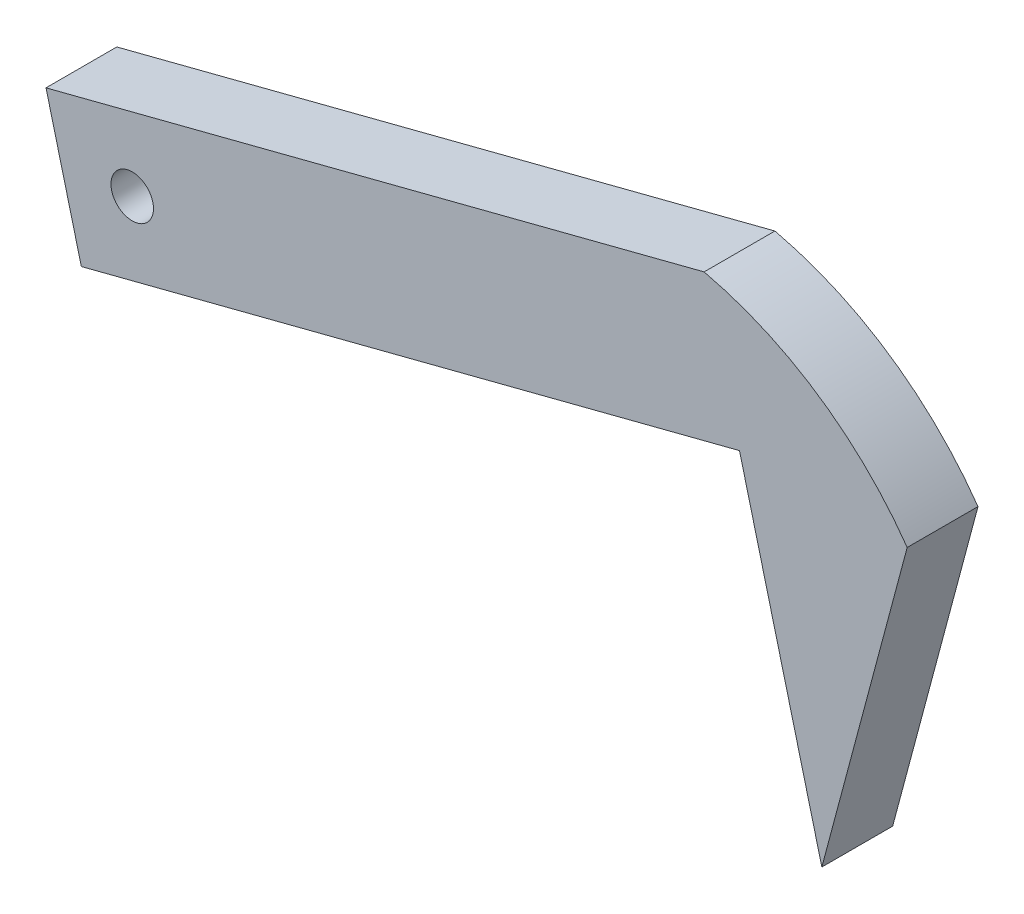
ISO-10303-21;
HEADER;
FILE_DESCRIPTION(('STEP AP214'),'2;1');
FILE_NAME('part.step','',(''),(''),'','','');
FILE_SCHEMA(('AUTOMOTIVE_DESIGN { 1 0 10303 214 1 1 1 1 }'));
ENDSEC;
DATA;
#1=APPLICATION_CONTEXT('core data for automotive mechanical design processes');
#2=APPLICATION_PROTOCOL_DEFINITION('international standard','automotive_design',2000,#1);
#3=PRODUCT_CONTEXT('',#1,'mechanical');
#4=PRODUCT('Part','Part','',(#3));
#5=PRODUCT_RELATED_PRODUCT_CATEGORY('part','',(#4));
#6=PRODUCT_DEFINITION_FORMATION('','',#4);
#7=PRODUCT_DEFINITION_CONTEXT('part definition',#1,'design');
#8=PRODUCT_DEFINITION('design','',#6,#7);
#9=PRODUCT_DEFINITION_SHAPE('','',#8);
#10=(LENGTH_UNIT() NAMED_UNIT(*) SI_UNIT(.MILLI.,.METRE.));
#11=(NAMED_UNIT(*) PLANE_ANGLE_UNIT() SI_UNIT($,.RADIAN.));
#12=(NAMED_UNIT(*) SI_UNIT($,.STERADIAN.) SOLID_ANGLE_UNIT());
#13=UNCERTAINTY_MEASURE_WITH_UNIT(LENGTH_MEASURE(1.E-05),#10,'distance_accuracy_value','');
#14=(GEOMETRIC_REPRESENTATION_CONTEXT(3) GLOBAL_UNCERTAINTY_ASSIGNED_CONTEXT((#13)) GLOBAL_UNIT_ASSIGNED_CONTEXT((#10,
#11,#12)) REPRESENTATION_CONTEXT('',''));
#15=CARTESIAN_POINT('',(0.,0.,0.));
#16=DIRECTION('',(0.,0.,1.));
#17=DIRECTION('',(1.,0.,0.));
#18=AXIS2_PLACEMENT_3D('',#15,#16,#17);
#19=CARTESIAN_POINT('',(40.949350237499,-11.6712049564434,5.));
#20=DIRECTION('',(0.,0.,-1.));
#21=DIRECTION('',(-1.,0.,0.));
#22=AXIS2_PLACEMENT_3D('',#19,#20,#21);
#23=PLANE('',#22);
#24=DIRECTION('',(-0.968342674749057,-0.249624646739542,0.));
#25=VECTOR('',#24,1.);
#26=CARTESIAN_POINT('',(0.,0.,5.));
#27=LINE('',#26,#25);
#28=CARTESIAN_POINT('',(46.4804483879548,11.981983043498,5.));
#29=VERTEX_POINT('',#28);
#30=CARTESIAN_POINT('',(0.,0.,5.));
#31=VERTEX_POINT('',#30);
#32=EDGE_CURVE('E128',#29,#31,#27,.T.);
#33=ORIENTED_EDGE('',*,*,#32,.T.);
#34=DIRECTION('',(0.249624646739542,-0.968342674749057,0.));
#35=VECTOR('',#34,1.);
#36=CARTESIAN_POINT('',(2.49624646739542,-9.68342674749057,5.));
#37=LINE('',#36,#35);
#38=CARTESIAN_POINT('',(2.49624646739542,-9.68342674749057,5.));
#39=VERTEX_POINT('',#38);
#40=EDGE_CURVE('E86',#31,#39,#37,.T.);
#41=ORIENTED_EDGE('',*,*,#40,.T.);
#42=DIRECTION('',(0.968342674749057,0.249624646739542,0.));
#43=VECTOR('',#42,1.);
#44=CARTESIAN_POINT('',(48.9766948553502,2.29855629600746,5.));
#45=LINE('',#44,#43);
#46=CARTESIAN_POINT('',(48.9766948553502,2.29855629600746,5.));
#47=VERTEX_POINT('',#46);
#48=EDGE_CURVE('E99',#39,#47,#45,.T.);
#49=ORIENTED_EDGE('',*,*,#48,.T.);
#50=DIRECTION('',(0.249624646739542,-0.968342674749057,0.));
#51=VECTOR('',#50,1.);
#52=CARTESIAN_POINT('',(48.9766948553502,2.29855629600746,5.));
#53=LINE('',#52,#51);
#54=CARTESIAN_POINT('',(54.7929576943068,-20.2638612700566,5.));
#55=VERTEX_POINT('',#54);
#56=EDGE_CURVE('E93',#47,#55,#53,.T.);
#57=ORIENTED_EDGE('',*,*,#56,.T.);
#58=DIRECTION('',(0.258148083591803,0.966105360164138,0.));
#59=VECTOR('',#58,1.);
#60=CARTESIAN_POINT('',(60.8217461640115,2.29855629600746,5.));
#61=LINE('',#60,#59);
#62=CARTESIAN_POINT('',(60.8217461640115,2.29855629600746,5.));
#63=VERTEX_POINT('',#62);
#64=EDGE_CURVE('E97',#55,#63,#61,.T.);
#65=ORIENTED_EDGE('',*,*,#64,.T.);
#66=CARTESIAN_POINT('',(40.949350237499,-11.6712049564434,5.));
#67=DIRECTION('',(0.,0.,1.));
#68=DIRECTION('',(-1.,0.,0.));
#69=AXIS2_PLACEMENT_3D('',#66,#67,#68);
#70=CIRCLE('',#69,24.2912813435304);
#71=EDGE_CURVE('E49',#63,#29,#70,.T.);
#72=ORIENTED_EDGE('',*,*,#71,.T.);
#73=EDGE_LOOP('',(#33,#41,#49,#57,#65,#72));
#74=FACE_BOUND('',#73,.T.);
#75=CARTESIAN_POINT('',(6.089836607443,-3.59359014004758,5.));
#76=DIRECTION('',(0.,0.,1.));
#77=DIRECTION('',(1.,0.,0.));
#78=AXIS2_PLACEMENT_3D('',#75,#76,#77);
#79=CIRCLE('',#78,1.5);
#80=CARTESIAN_POINT('',(7.589836607443,-3.59359014004758,5.));
#81=VERTEX_POINT('',#80);
#82=EDGE_CURVE('E121',#81,#81,#79,.T.);
#83=ORIENTED_EDGE('',*,*,#82,.F.);
#84=EDGE_LOOP('',(#83));
#85=FACE_BOUND('',#84,.T.);
#86=ADVANCED_FACE('F32',(#74,#85),#23,.F.);
#87=CARTESIAN_POINT('',(40.949350237499,-11.6712049564434,0.));
#88=DIRECTION('',(0.,0.,-1.));
#89=DIRECTION('',(-1.,0.,0.));
#90=AXIS2_PLACEMENT_3D('',#87,#88,#89);
#91=PLANE('',#90);
#92=DIRECTION('',(-0.968342674749057,-0.249624646739542,0.));
#93=VECTOR('',#92,1.);
#94=CARTESIAN_POINT('',(0.,0.,0.));
#95=LINE('',#94,#93);
#96=CARTESIAN_POINT('',(46.4804483879548,11.981983043498,0.));
#97=VERTEX_POINT('',#96);
#98=CARTESIAN_POINT('',(0.,0.,0.));
#99=VERTEX_POINT('',#98);
#100=EDGE_CURVE('E117',#97,#99,#95,.T.);
#101=ORIENTED_EDGE('',*,*,#100,.F.);
#102=CARTESIAN_POINT('',(40.949350237499,-11.6712049564434,0.));
#103=DIRECTION('',(0.,0.,1.));
#104=DIRECTION('',(-1.,0.,0.));
#105=AXIS2_PLACEMENT_3D('',#102,#103,#104);
#106=CIRCLE('',#105,24.2912813435304);
#107=CARTESIAN_POINT('',(60.8217461640115,2.29855629600746,0.));
#108=VERTEX_POINT('',#107);
#109=EDGE_CURVE('E78',#108,#97,#106,.T.);
#110=ORIENTED_EDGE('',*,*,#109,.F.);
#111=DIRECTION('',(0.258148083591803,0.966105360164138,0.));
#112=VECTOR('',#111,1.);
#113=CARTESIAN_POINT('',(60.8217461640115,2.29855629600746,0.));
#114=LINE('',#113,#112);
#115=CARTESIAN_POINT('',(54.7929576943068,-20.2638612700566,0.));
#116=VERTEX_POINT('',#115);
#117=EDGE_CURVE('E72',#116,#108,#114,.T.);
#118=ORIENTED_EDGE('',*,*,#117,.F.);
#119=DIRECTION('',(0.249624646739542,-0.968342674749057,0.));
#120=VECTOR('',#119,1.);
#121=CARTESIAN_POINT('',(48.9766948553502,2.29855629600746,0.));
#122=LINE('',#121,#120);
#123=CARTESIAN_POINT('',(48.9766948553502,2.29855629600746,0.));
#124=VERTEX_POINT('',#123);
#125=EDGE_CURVE('E107',#124,#116,#122,.T.);
#126=ORIENTED_EDGE('',*,*,#125,.F.);
#127=DIRECTION('',(0.968342674749057,0.249624646739542,0.));
#128=VECTOR('',#127,1.);
#129=CARTESIAN_POINT('',(48.9766948553502,2.29855629600746,0.));
#130=LINE('',#129,#128);
#131=CARTESIAN_POINT('',(2.49624646739542,-9.68342674749057,0.));
#132=VERTEX_POINT('',#131);
#133=EDGE_CURVE('E123',#132,#124,#130,.T.);
#134=ORIENTED_EDGE('',*,*,#133,.F.);
#135=DIRECTION('',(0.249624646739542,-0.968342674749057,0.));
#136=VECTOR('',#135,1.);
#137=CARTESIAN_POINT('',(2.49624646739542,-9.68342674749057,0.));
#138=LINE('',#137,#136);
#139=EDGE_CURVE('E120',#99,#132,#138,.T.);
#140=ORIENTED_EDGE('',*,*,#139,.F.);
#141=EDGE_LOOP('',(#101,#110,#118,#126,#134,#140));
#142=FACE_BOUND('',#141,.T.);
#143=CARTESIAN_POINT('',(6.089836607443,-3.59359014004758,0.));
#144=DIRECTION('',(0.,0.,1.));
#145=DIRECTION('',(1.,0.,0.));
#146=AXIS2_PLACEMENT_3D('',#143,#144,#145);
#147=CIRCLE('',#146,1.5);
#148=CARTESIAN_POINT('',(7.589836607443,-3.59359014004758,0.));
#149=VERTEX_POINT('',#148);
#150=EDGE_CURVE('E221',#149,#149,#147,.T.);
#151=ORIENTED_EDGE('',*,*,#150,.T.);
#152=EDGE_LOOP('',(#151));
#153=FACE_BOUND('',#152,.T.);
#154=ADVANCED_FACE('F137',(#142,#153),#91,.T.);
#155=CARTESIAN_POINT('',(0.,0.,5.));
#156=DIRECTION('',(0.249624646739542,-0.968342674749057,0.));
#157=DIRECTION('',(0.968342674749058,0.249624646739542,0.));
#158=AXIS2_PLACEMENT_3D('',#155,#156,#157);
#159=PLANE('',#158);
#160=ORIENTED_EDGE('',*,*,#100,.T.);
#161=DIRECTION('',(0.,0.,-1.));
#162=VECTOR('',#161,1.);
#163=CARTESIAN_POINT('',(0.,0.,5.));
#164=LINE('',#163,#162);
#165=EDGE_CURVE('E11',#31,#99,#164,.T.);
#166=ORIENTED_EDGE('',*,*,#165,.F.);
#167=ORIENTED_EDGE('',*,*,#32,.F.);
#168=DIRECTION('',(0.,0.,-1.));
#169=VECTOR('',#168,1.);
#170=CARTESIAN_POINT('',(46.4804483879548,11.981983043498,5.));
#171=LINE('',#170,#169);
#172=EDGE_CURVE('E113',#29,#97,#171,.T.);
#173=ORIENTED_EDGE('',*,*,#172,.T.);
#174=EDGE_LOOP('',(#160,#166,#167,#173));
#175=FACE_BOUND('',#174,.T.);
#176=ADVANCED_FACE('F34',(#175),#159,.F.);
#177=CARTESIAN_POINT('',(2.49624646739542,-9.68342674749057,5.));
#178=DIRECTION('',(0.968342674749057,0.249624646739542,0.));
#179=DIRECTION('',(-0.249624646739542,0.968342674749058,0.));
#180=AXIS2_PLACEMENT_3D('',#177,#178,#179);
#181=PLANE('',#180);
#182=ORIENTED_EDGE('',*,*,#139,.T.);
#183=DIRECTION('',(0.,0.,-1.));
#184=VECTOR('',#183,1.);
#185=CARTESIAN_POINT('',(2.49624646739542,-9.68342674749057,5.));
#186=LINE('',#185,#184);
#187=EDGE_CURVE('E41',#39,#132,#186,.T.);
#188=ORIENTED_EDGE('',*,*,#187,.F.);
#189=ORIENTED_EDGE('',*,*,#40,.F.);
#190=ORIENTED_EDGE('',*,*,#165,.T.);
#191=EDGE_LOOP('',(#182,#188,#189,#190));
#192=FACE_BOUND('',#191,.T.);
#193=ADVANCED_FACE('F162',(#192),#181,.F.);
#194=CARTESIAN_POINT('',(48.9766948553502,2.29855629600746,5.));
#195=DIRECTION('',(-0.249624646739542,0.968342674749057,0.));
#196=DIRECTION('',(-0.968342674749057,-0.249624646739542,0.));
#197=AXIS2_PLACEMENT_3D('',#194,#195,#196);
#198=PLANE('',#197);
#199=ORIENTED_EDGE('',*,*,#133,.T.);
#200=DIRECTION('',(0.,0.,-1.));
#201=VECTOR('',#200,1.);
#202=CARTESIAN_POINT('',(48.9766948553502,2.29855629600746,5.));
#203=LINE('',#202,#201);
#204=EDGE_CURVE('E108',#47,#124,#203,.T.);
#205=ORIENTED_EDGE('',*,*,#204,.F.);
#206=ORIENTED_EDGE('',*,*,#48,.F.);
#207=ORIENTED_EDGE('',*,*,#187,.T.);
#208=EDGE_LOOP('',(#199,#205,#206,#207));
#209=FACE_BOUND('',#208,.T.);
#210=ADVANCED_FACE('F134',(#209),#198,.F.);
#211=CARTESIAN_POINT('',(48.9766948553502,2.29855629600746,5.));
#212=DIRECTION('',(0.968342674749057,0.249624646739542,0.));
#213=DIRECTION('',(-0.249624646739542,0.968342674749057,0.));
#214=AXIS2_PLACEMENT_3D('',#211,#212,#213);
#215=PLANE('',#214);
#216=ORIENTED_EDGE('',*,*,#125,.T.);
#217=DIRECTION('',(0.,0.,-1.));
#218=VECTOR('',#217,1.);
#219=CARTESIAN_POINT('',(54.7929576943068,-20.2638612700566,5.));
#220=LINE('',#219,#218);
#221=EDGE_CURVE('E104',#55,#116,#220,.T.);
#222=ORIENTED_EDGE('',*,*,#221,.F.);
#223=ORIENTED_EDGE('',*,*,#56,.F.);
#224=ORIENTED_EDGE('',*,*,#204,.T.);
#225=EDGE_LOOP('',(#216,#222,#223,#224));
#226=FACE_BOUND('',#225,.T.);
#227=ADVANCED_FACE('F105',(#226),#215,.F.);
#228=CARTESIAN_POINT('',(60.8217461640115,2.29855629600746,5.));
#229=DIRECTION('',(-0.966105360164139,0.258148083591803,0.));
#230=DIRECTION('',(-0.258148083591803,-0.966105360164139,0.));
#231=AXIS2_PLACEMENT_3D('',#228,#229,#230);
#232=PLANE('',#231);
#233=ORIENTED_EDGE('',*,*,#117,.T.);
#234=DIRECTION('',(0.,0.,-1.));
#235=VECTOR('',#234,1.);
#236=CARTESIAN_POINT('',(60.8217461640115,2.29855629600746,5.));
#237=LINE('',#236,#235);
#238=EDGE_CURVE('E109',#63,#108,#237,.T.);
#239=ORIENTED_EDGE('',*,*,#238,.F.);
#240=ORIENTED_EDGE('',*,*,#64,.F.);
#241=ORIENTED_EDGE('',*,*,#221,.T.);
#242=EDGE_LOOP('',(#233,#239,#240,#241));
#243=FACE_BOUND('',#242,.T.);
#244=ADVANCED_FACE('F111',(#243),#232,.F.);
#245=CARTESIAN_POINT('',(40.949350237499,-11.6712049564434,5.));
#246=DIRECTION('',(0.,0.,-1.));
#247=DIRECTION('',(-1.,0.,0.));
#248=AXIS2_PLACEMENT_3D('',#245,#246,#247);
#249=CYLINDRICAL_SURFACE('',#248,24.2912813435304);
#250=ORIENTED_EDGE('',*,*,#109,.T.);
#251=ORIENTED_EDGE('',*,*,#172,.F.);
#252=ORIENTED_EDGE('',*,*,#71,.F.);
#253=ORIENTED_EDGE('',*,*,#238,.T.);
#254=EDGE_LOOP('',(#250,#251,#252,#253));
#255=FACE_BOUND('',#254,.T.);
#256=ADVANCED_FACE('F142',(#255),#249,.T.);
#257=CARTESIAN_POINT('',(6.089836607443,-3.59359014004758,5.));
#258=DIRECTION('',(0.,0.,-1.));
#259=DIRECTION('',(-1.,0.,0.));
#260=AXIS2_PLACEMENT_3D('',#257,#258,#259);
#261=CYLINDRICAL_SURFACE('',#260,1.5);
#262=ORIENTED_EDGE('',*,*,#82,.T.);
#263=EDGE_LOOP('',(#262));
#264=FACE_BOUND('',#263,.T.);
#265=ORIENTED_EDGE('',*,*,#150,.F.);
#266=EDGE_LOOP('',(#265));
#267=FACE_BOUND('',#266,.T.);
#268=ADVANCED_FACE('F144',(#264,#267),#261,.F.);
#269=CLOSED_SHELL('',(#86,#154,#176,#193,#210,#227,#244,#256,#268));
#270=MANIFOLD_SOLID_BREP('B2',#269);
#271=ADVANCED_BREP_SHAPE_REPRESENTATION('',(#18,#270),#14);
#272=SHAPE_DEFINITION_REPRESENTATION(#9,#271);
ENDSEC;
END-ISO-10303-21;
